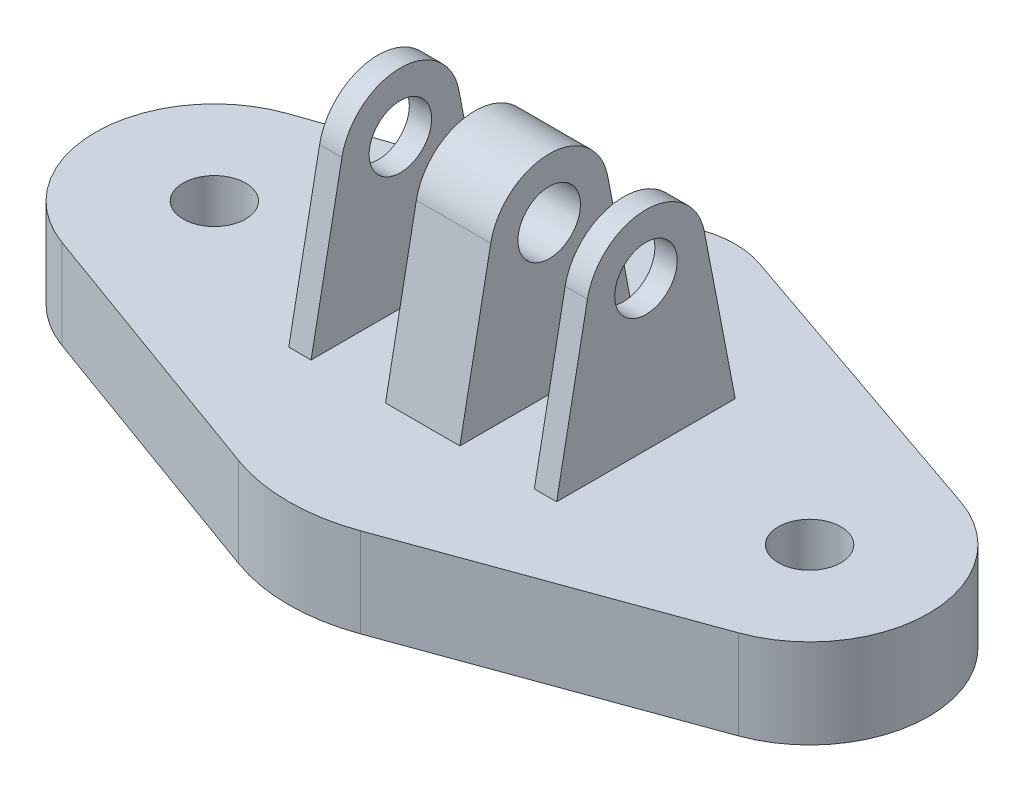
ISO-10303-21;
HEADER;
FILE_DESCRIPTION(('STEP AP214'),'2;1');
FILE_NAME('part.step','',(''),(''),'','','');
FILE_SCHEMA(('AUTOMOTIVE_DESIGN { 1 0 10303 214 1 1 1 1 }'));
ENDSEC;
DATA;
#1=APPLICATION_CONTEXT('core data for automotive mechanical design processes');
#2=APPLICATION_PROTOCOL_DEFINITION('international standard','automotive_design',2000,#1);
#3=PRODUCT_CONTEXT('',#1,'mechanical');
#4=PRODUCT('Part','Part','',(#3));
#5=PRODUCT_RELATED_PRODUCT_CATEGORY('part','',(#4));
#6=PRODUCT_DEFINITION_FORMATION('','',#4);
#7=PRODUCT_DEFINITION_CONTEXT('part definition',#1,'design');
#8=PRODUCT_DEFINITION('design','',#6,#7);
#9=PRODUCT_DEFINITION_SHAPE('','',#8);
#10=(LENGTH_UNIT() NAMED_UNIT(*) SI_UNIT(.MILLI.,.METRE.));
#11=(NAMED_UNIT(*) PLANE_ANGLE_UNIT() SI_UNIT($,.RADIAN.));
#12=(NAMED_UNIT(*) SI_UNIT($,.STERADIAN.) SOLID_ANGLE_UNIT());
#13=UNCERTAINTY_MEASURE_WITH_UNIT(LENGTH_MEASURE(1.E-05),#10,'distance_accuracy_value','');
#14=(GEOMETRIC_REPRESENTATION_CONTEXT(3) GLOBAL_UNCERTAINTY_ASSIGNED_CONTEXT((#13)) GLOBAL_UNIT_ASSIGNED_CONTEXT((#10,
#11,#12)) REPRESENTATION_CONTEXT('',''));
#15=CARTESIAN_POINT('',(0.,0.,0.));
#16=DIRECTION('',(0.,0.,1.));
#17=DIRECTION('',(1.,0.,0.));
#18=AXIS2_PLACEMENT_3D('',#15,#16,#17);
#19=CARTESIAN_POINT('',(9.,16.7566678500182,-3.92777975003039));
#20=DIRECTION('',(0.,-0.189166962504558,0.981944937507597));
#21=DIRECTION('',(0.,-0.981944937507597,-0.189166962504558));
#22=AXIS2_PLACEMENT_3D('',#19,#20,#21);
#23=PLANE('',#22);
#24=DIRECTION('',(0.,0.981944937507597,0.189166962504558));
#25=VECTOR('',#24,1.);
#26=CARTESIAN_POINT('',(2.5,16.7566678500182,-3.92777975003039));
#27=LINE('',#26,#25);
#28=CARTESIAN_POINT('',(2.5,6.,-6.));
#29=VERTEX_POINT('',#28);
#30=CARTESIAN_POINT('',(2.5,16.7566678500182,-3.92777975003039));
#31=VERTEX_POINT('',#30);
#32=EDGE_CURVE('E323',#29,#31,#27,.T.);
#33=ORIENTED_EDGE('',*,*,#32,.F.);
#34=DIRECTION('',(-1.,0.,0.));
#35=VECTOR('',#34,1.);
#36=CARTESIAN_POINT('',(9.,6.,-6.));
#37=LINE('',#36,#35);
#38=CARTESIAN_POINT('',(-2.5,6.,-6.));
#39=VERTEX_POINT('',#38);
#40=EDGE_CURVE('E212',#29,#39,#37,.T.);
#41=ORIENTED_EDGE('',*,*,#40,.T.);
#42=DIRECTION('',(0.,0.981944937507597,0.189166962504558));
#43=VECTOR('',#42,1.);
#44=CARTESIAN_POINT('',(-2.5,16.7566678500182,-3.92777975003039));
#45=LINE('',#44,#43);
#46=CARTESIAN_POINT('',(-2.5,16.7566678500182,-3.92777975003039));
#47=VERTEX_POINT('',#46);
#48=EDGE_CURVE('E295',#39,#47,#45,.T.);
#49=ORIENTED_EDGE('',*,*,#48,.T.);
#50=DIRECTION('',(-1.,0.,0.));
#51=VECTOR('',#50,1.);
#52=CARTESIAN_POINT('',(9.,16.7566678500182,-3.92777975003039));
#53=LINE('',#52,#51);
#54=EDGE_CURVE('E230',#31,#47,#53,.T.);
#55=ORIENTED_EDGE('',*,*,#54,.F.);
#56=EDGE_LOOP('',(#33,#41,#49,#55));
#57=FACE_BOUND('',#56,.T.);
#58=ADVANCED_FACE('F43',(#57),#23,.F.);
#59=DIRECTION('',(0.,-0.981944937507597,-0.189166962504558));
#60=VECTOR('',#59,1.);
#61=CARTESIAN_POINT('',(7.5,16.7566678500182,-3.92777975003039));
#62=LINE('',#61,#60);
#63=CARTESIAN_POINT('',(7.5,16.7566678500182,-3.92777975003039));
#64=VERTEX_POINT('',#63);
#65=CARTESIAN_POINT('',(7.5,6.,-6.));
#66=VERTEX_POINT('',#65);
#67=EDGE_CURVE('E182',#64,#66,#62,.T.);
#68=ORIENTED_EDGE('',*,*,#67,.F.);
#69=CARTESIAN_POINT('',(9.,16.7566678500182,-3.92777975003039));
#70=VERTEX_POINT('',#69);
#71=EDGE_CURVE('E223',#70,#64,#53,.T.);
#72=ORIENTED_EDGE('',*,*,#71,.F.);
#73=DIRECTION('',(0.,0.981944937507597,0.189166962504558));
#74=VECTOR('',#73,1.);
#75=CARTESIAN_POINT('',(9.,16.7566678500182,-3.92777975003039));
#76=LINE('',#75,#74);
#77=CARTESIAN_POINT('',(9.,6.,-6.));
#78=VERTEX_POINT('',#77);
#79=EDGE_CURVE('E208',#78,#70,#76,.T.);
#80=ORIENTED_EDGE('',*,*,#79,.F.);
#81=EDGE_CURVE('E200',#78,#66,#37,.T.);
#82=ORIENTED_EDGE('',*,*,#81,.T.);
#83=EDGE_LOOP('',(#68,#72,#80,#82));
#84=FACE_BOUND('',#83,.T.);
#85=ADVANCED_FACE('F207',(#84),#23,.F.);
#86=CARTESIAN_POINT('',(9.,16.,0.));
#87=DIRECTION('',(-1.,0.,0.));
#88=DIRECTION('',(0.,0.,1.));
#89=AXIS2_PLACEMENT_3D('',#86,#87,#88);
#90=CYLINDRICAL_SURFACE('',#89,4.);
#91=CARTESIAN_POINT('',(2.5,16.,0.));
#92=DIRECTION('',(1.,0.,0.));
#93=DIRECTION('',(0.,0.,-1.));
#94=AXIS2_PLACEMENT_3D('',#91,#92,#93);
#95=CIRCLE('',#94,4.);
#96=CARTESIAN_POINT('',(2.5,16.7566678500182,3.92777975003039));
#97=VERTEX_POINT('',#96);
#98=EDGE_CURVE('E329',#31,#97,#95,.T.);
#99=ORIENTED_EDGE('',*,*,#98,.F.);
#100=ORIENTED_EDGE('',*,*,#54,.T.);
#101=CARTESIAN_POINT('',(-2.5,16.,0.));
#102=DIRECTION('',(1.,0.,0.));
#103=DIRECTION('',(0.,0.,-1.));
#104=AXIS2_PLACEMENT_3D('',#101,#102,#103);
#105=CIRCLE('',#104,4.);
#106=CARTESIAN_POINT('',(-2.5,16.7566678500182,3.92777975003039));
#107=VERTEX_POINT('',#106);
#108=EDGE_CURVE('E302',#47,#107,#105,.T.);
#109=ORIENTED_EDGE('',*,*,#108,.T.);
#110=DIRECTION('',(-1.,0.,0.));
#111=VECTOR('',#110,1.);
#112=CARTESIAN_POINT('',(9.,16.7566678500182,3.92777975003039));
#113=LINE('',#112,#111);
#114=EDGE_CURVE('E243',#97,#107,#113,.T.);
#115=ORIENTED_EDGE('',*,*,#114,.F.);
#116=EDGE_LOOP('',(#99,#100,#109,#115));
#117=FACE_BOUND('',#116,.T.);
#118=ADVANCED_FACE('F377',(#117),#90,.T.);
#119=CARTESIAN_POINT('',(7.5,16.,0.));
#120=DIRECTION('',(-1.,0.,0.));
#121=DIRECTION('',(0.,-1.,0.));
#122=AXIS2_PLACEMENT_3D('',#119,#120,#121);
#123=CIRCLE('',#122,4.);
#124=CARTESIAN_POINT('',(7.5,16.7566678500182,3.92777975003039));
#125=VERTEX_POINT('',#124);
#126=EDGE_CURVE('E188',#125,#64,#123,.T.);
#127=ORIENTED_EDGE('',*,*,#126,.F.);
#128=CARTESIAN_POINT('',(9.,16.7566678500182,3.92777975003039));
#129=VERTEX_POINT('',#128);
#130=EDGE_CURVE('E237',#129,#125,#113,.T.);
#131=ORIENTED_EDGE('',*,*,#130,.F.);
#132=CARTESIAN_POINT('',(9.,16.,0.));
#133=DIRECTION('',(1.,0.,0.));
#134=DIRECTION('',(0.,0.,1.));
#135=AXIS2_PLACEMENT_3D('',#132,#133,#134);
#136=CIRCLE('',#135,4.);
#137=EDGE_CURVE('E266',#70,#129,#136,.T.);
#138=ORIENTED_EDGE('',*,*,#137,.F.);
#139=ORIENTED_EDGE('',*,*,#71,.T.);
#140=EDGE_LOOP('',(#127,#131,#138,#139));
#141=FACE_BOUND('',#140,.T.);
#142=ADVANCED_FACE('F386',(#141),#90,.T.);
#143=CARTESIAN_POINT('',(9.,6.,6.));
#144=DIRECTION('',(0.,-0.189166962504558,-0.981944937507597));
#145=DIRECTION('',(0.,0.981944937507597,-0.189166962504558));
#146=AXIS2_PLACEMENT_3D('',#143,#144,#145);
#147=PLANE('',#146);
#148=DIRECTION('',(0.,-0.981944937507597,0.189166962504558));
#149=VECTOR('',#148,1.);
#150=CARTESIAN_POINT('',(2.5,6.,6.));
#151=LINE('',#150,#149);
#152=CARTESIAN_POINT('',(2.5,6.,6.));
#153=VERTEX_POINT('',#152);
#154=EDGE_CURVE('E332',#97,#153,#151,.T.);
#155=ORIENTED_EDGE('',*,*,#154,.F.);
#156=ORIENTED_EDGE('',*,*,#114,.T.);
#157=DIRECTION('',(0.,-0.981944937507597,0.189166962504558));
#158=VECTOR('',#157,1.);
#159=CARTESIAN_POINT('',(-2.5,6.,6.));
#160=LINE('',#159,#158);
#161=CARTESIAN_POINT('',(-2.5,6.,6.));
#162=VERTEX_POINT('',#161);
#163=EDGE_CURVE('E306',#107,#162,#160,.T.);
#164=ORIENTED_EDGE('',*,*,#163,.T.);
#165=DIRECTION('',(-1.,0.,0.));
#166=VECTOR('',#165,1.);
#167=CARTESIAN_POINT('',(9.,6.,6.));
#168=LINE('',#167,#166);
#169=EDGE_CURVE('E255',#153,#162,#168,.T.);
#170=ORIENTED_EDGE('',*,*,#169,.F.);
#171=EDGE_LOOP('',(#155,#156,#164,#170));
#172=FACE_BOUND('',#171,.T.);
#173=ADVANCED_FACE('F384',(#172),#147,.F.);
#174=DIRECTION('',(0.,0.981944937507597,-0.189166962504558));
#175=VECTOR('',#174,1.);
#176=CARTESIAN_POINT('',(7.5,6.,6.));
#177=LINE('',#176,#175);
#178=CARTESIAN_POINT('',(7.5,6.,6.));
#179=VERTEX_POINT('',#178);
#180=EDGE_CURVE('E340',#179,#125,#177,.T.);
#181=ORIENTED_EDGE('',*,*,#180,.F.);
#182=CARTESIAN_POINT('',(9.,6.,6.));
#183=VERTEX_POINT('',#182);
#184=EDGE_CURVE('E203',#183,#179,#168,.T.);
#185=ORIENTED_EDGE('',*,*,#184,.F.);
#186=DIRECTION('',(0.,-0.981944937507597,0.189166962504558));
#187=VECTOR('',#186,1.);
#188=CARTESIAN_POINT('',(9.,6.,6.));
#189=LINE('',#188,#187);
#190=EDGE_CURVE('E260',#129,#183,#189,.T.);
#191=ORIENTED_EDGE('',*,*,#190,.F.);
#192=ORIENTED_EDGE('',*,*,#130,.T.);
#193=EDGE_LOOP('',(#181,#185,#191,#192));
#194=FACE_BOUND('',#193,.T.);
#195=ADVANCED_FACE('F360',(#194),#147,.F.);
#196=CARTESIAN_POINT('',(9.,16.,0.));
#197=DIRECTION('',(-1.,0.,0.));
#198=DIRECTION('',(0.,0.,1.));
#199=AXIS2_PLACEMENT_3D('',#196,#197,#198);
#200=CYLINDRICAL_SURFACE('',#199,2.1);
#201=CARTESIAN_POINT('',(-2.5,16.,0.));
#202=DIRECTION('',(1.,0.,0.));
#203=DIRECTION('',(0.,0.,-1.));
#204=AXIS2_PLACEMENT_3D('',#201,#202,#203);
#205=CIRCLE('',#204,2.1);
#206=CARTESIAN_POINT('',(-2.5,16.,2.1));
#207=VERTEX_POINT('',#206);
#208=EDGE_CURVE('E47',#207,#207,#205,.T.);
#209=CARTESIAN_POINT('',(2.5,16.,0.));
#210=DIRECTION('',(1.,0.,0.));
#211=DIRECTION('',(0.,0.,-1.));
#212=AXIS2_PLACEMENT_3D('',#209,#210,#211);
#213=CIRCLE('',#212,2.1);
#214=CARTESIAN_POINT('',(2.5,16.,2.1));
#215=VERTEX_POINT('',#214);
#216=EDGE_CURVE('E194',#215,#215,#213,.T.);
#217=CARTESIAN_POINT('',(-2.5,16.,2.1));
#218=CARTESIAN_POINT('',(-2.44791666666667,16.,2.1));
#219=CARTESIAN_POINT('',(-2.39583333333333,16.,2.1));
#220=CARTESIAN_POINT('',(-2.29166666666667,16.,2.1));
#221=CARTESIAN_POINT('',(-2.23958333333333,16.,2.1));
#222=CARTESIAN_POINT('',(-2.13541666666667,16.,2.1));
#223=CARTESIAN_POINT('',(-2.08333333333333,16.,2.1));
#224=CARTESIAN_POINT('',(-1.97916666666667,16.,2.1));
#225=CARTESIAN_POINT('',(-1.92708333333333,16.,2.1));
#226=CARTESIAN_POINT('',(-1.82291666666667,16.,2.1));
#227=CARTESIAN_POINT('',(-1.77083333333333,16.,2.1));
#228=CARTESIAN_POINT('',(-1.66666666666667,16.,2.1));
#229=CARTESIAN_POINT('',(-1.61458333333333,16.,2.1));
#230=CARTESIAN_POINT('',(-1.51041666666667,16.,2.1));
#231=CARTESIAN_POINT('',(-1.45833333333333,16.,2.1));
#232=CARTESIAN_POINT('',(-1.35416666666667,16.,2.1));
#233=CARTESIAN_POINT('',(-1.30208333333333,16.,2.1));
#234=CARTESIAN_POINT('',(-1.19791666666667,16.,2.1));
#235=CARTESIAN_POINT('',(-1.14583333333333,16.,2.1));
#236=CARTESIAN_POINT('',(-1.04166666666667,16.,2.1));
#237=CARTESIAN_POINT('',(-0.989583333333334,16.,2.1));
#238=CARTESIAN_POINT('',(-0.885416666666668,16.,2.1));
#239=CARTESIAN_POINT('',(-0.833333333333334,16.,2.1));
#240=CARTESIAN_POINT('',(-0.729166666666667,16.,2.1));
#241=CARTESIAN_POINT('',(-0.677083333333334,16.,2.1));
#242=CARTESIAN_POINT('',(-0.572916666666667,16.,2.1));
#243=CARTESIAN_POINT('',(-0.520833333333334,16.,2.1));
#244=CARTESIAN_POINT('',(-0.416666666666667,16.,2.1));
#245=CARTESIAN_POINT('',(-0.364583333333334,16.,2.1));
#246=CARTESIAN_POINT('',(-0.260416666666667,16.,2.1));
#247=CARTESIAN_POINT('',(-0.208333333333334,16.,2.1));
#248=CARTESIAN_POINT('',(-0.104166666666667,16.,2.1));
#249=CARTESIAN_POINT('',(-0.0520833333333334,16.,2.1));
#250=CARTESIAN_POINT('',(0.0520833333333334,16.,2.1));
#251=CARTESIAN_POINT('',(0.104166666666667,16.,2.1));
#252=CARTESIAN_POINT('',(0.208333333333334,16.,2.1));
#253=CARTESIAN_POINT('',(0.260416666666667,16.,2.1));
#254=CARTESIAN_POINT('',(0.364583333333334,16.,2.1));
#255=CARTESIAN_POINT('',(0.416666666666667,16.,2.1));
#256=CARTESIAN_POINT('',(0.520833333333334,16.,2.1));
#257=CARTESIAN_POINT('',(0.572916666666667,16.,2.1));
#258=CARTESIAN_POINT('',(0.677083333333334,16.,2.1));
#259=CARTESIAN_POINT('',(0.729166666666667,16.,2.1));
#260=CARTESIAN_POINT('',(0.833333333333333,16.,2.1));
#261=CARTESIAN_POINT('',(0.885416666666666,16.,2.1));
#262=CARTESIAN_POINT('',(0.989583333333333,16.,2.1));
#263=CARTESIAN_POINT('',(1.04166666666667,16.,2.1));
#264=CARTESIAN_POINT('',(1.14583333333333,16.,2.1));
#265=CARTESIAN_POINT('',(1.19791666666667,16.,2.1));
#266=CARTESIAN_POINT('',(1.30208333333333,16.,2.1));
#267=CARTESIAN_POINT('',(1.35416666666667,16.,2.1));
#268=CARTESIAN_POINT('',(1.45833333333333,16.,2.1));
#269=CARTESIAN_POINT('',(1.51041666666667,16.,2.1));
#270=CARTESIAN_POINT('',(1.61458333333333,16.,2.1));
#271=CARTESIAN_POINT('',(1.66666666666667,16.,2.1));
#272=CARTESIAN_POINT('',(1.77083333333333,16.,2.1));
#273=CARTESIAN_POINT('',(1.82291666666667,16.,2.1));
#274=CARTESIAN_POINT('',(1.92708333333333,16.,2.1));
#275=CARTESIAN_POINT('',(1.97916666666667,16.,2.1));
#276=CARTESIAN_POINT('',(2.08333333333333,16.,2.1));
#277=CARTESIAN_POINT('',(2.13541666666667,16.,2.1));
#278=CARTESIAN_POINT('',(2.23958333333333,16.,2.1));
#279=CARTESIAN_POINT('',(2.29166666666667,16.,2.1));
#280=CARTESIAN_POINT('',(2.39583333333333,16.,2.1));
#281=CARTESIAN_POINT('',(2.44791666666667,16.,2.1));
#282=CARTESIAN_POINT('',(2.5,16.,2.1));
#283=B_SPLINE_CURVE_WITH_KNOTS('',3,(#217,#218,#219,#220,#221,#222,#223,#224,#225,#226,#227,
#228,#229,#230,#231,#232,#233,#234,#235,#236,#237,#238,#239,#240,#241,#242,#243,#244,#245,#246,
#247,#248,#249,#250,#251,#252,#253,#254,#255,#256,#257,#258,#259,#260,#261,#262,#263,#264,#265,
#266,#267,#268,#269,#270,#271,#272,#273,#274,#275,#276,#277,#278,#279,#280,#281,#282),
.UNSPECIFIED.,.F.,.F.,(4,2,2,2,2,2,2,2,2,2,2,2,2,2,2,2,2,2,2,2,2,2,2,2,2,2,2,2,2,2,2,2,4),(0.,
0.15625,0.3125,0.46875,0.625000000000001,0.781250000000001,0.937500000000001,1.09375,1.25,
1.40625,1.5625,1.71875,1.875,2.03125,2.1875,2.34375,2.5,2.65625,2.8125,2.96875,3.125,3.28125,
3.4375,3.59375,3.75,3.90625,4.0625,4.21875,4.375,4.53125,4.6875,4.84375,5.),.UNSPECIFIED.);
#284=EDGE_CURVE('BSEAM356',#207,#215,#283,.T.);
#285=ORIENTED_EDGE('',*,*,#208,.F.);
#286=ORIENTED_EDGE('',*,*,#216,.T.);
#287=ORIENTED_EDGE('',*,*,#284,.T.);
#288=ORIENTED_EDGE('',*,*,#284,.F.);
#289=EDGE_LOOP('',(#285,#287,#286,#288));
#290=FACE_BOUND('',#289,.T.);
#291=ADVANCED_FACE('F356',(#290),#200,.F.);
#292=CARTESIAN_POINT('',(9.,16.,0.));
#293=DIRECTION('',(1.,0.,0.));
#294=DIRECTION('',(0.,0.,-1.));
#295=AXIS2_PLACEMENT_3D('',#292,#293,#294);
#296=CIRCLE('',#295,2.1);
#297=CARTESIAN_POINT('',(9.,16.,-2.1));
#298=VERTEX_POINT('',#297);
#299=EDGE_CURVE('E277',#298,#298,#296,.T.);
#300=ORIENTED_EDGE('',*,*,#299,.T.);
#301=EDGE_LOOP('',(#300));
#302=FACE_BOUND('',#301,.T.);
#303=CARTESIAN_POINT('',(7.5,16.,0.));
#304=DIRECTION('',(-1.,0.,0.));
#305=DIRECTION('',(0.,-1.,0.));
#306=AXIS2_PLACEMENT_3D('',#303,#304,#305);
#307=CIRCLE('',#306,2.1);
#308=CARTESIAN_POINT('',(7.5,13.9,0.));
#309=VERTEX_POINT('',#308);
#310=EDGE_CURVE('E205',#309,#309,#307,.T.);
#311=ORIENTED_EDGE('',*,*,#310,.T.);
#312=EDGE_LOOP('',(#311));
#313=FACE_BOUND('',#312,.T.);
#314=ADVANCED_FACE('F359',(#302,#313),#200,.F.);
#315=CARTESIAN_POINT('',(20.,6.,0.));
#316=DIRECTION('',(0.,-1.,0.));
#317=DIRECTION('',(0.,0.,-1.));
#318=AXIS2_PLACEMENT_3D('',#315,#316,#317);
#319=PLANE('',#318);
#320=ORIENTED_EDGE('',*,*,#40,.F.);
#321=DIRECTION('',(0.,0.,1.));
#322=VECTOR('',#321,1.);
#323=CARTESIAN_POINT('',(2.5,6.,-15.));
#324=LINE('',#323,#322);
#325=EDGE_CURVE('E61',#29,#153,#324,.T.);
#326=ORIENTED_EDGE('',*,*,#325,.T.);
#327=ORIENTED_EDGE('',*,*,#169,.T.);
#328=DIRECTION('',(0.,0.,1.));
#329=VECTOR('',#328,1.);
#330=CARTESIAN_POINT('',(-2.5,6.,-15.));
#331=LINE('',#330,#329);
#332=EDGE_CURVE('E322',#39,#162,#331,.T.);
#333=ORIENTED_EDGE('',*,*,#332,.F.);
#334=EDGE_LOOP('',(#320,#326,#327,#333));
#335=FACE_BOUND('',#334,.T.);
#336=DIRECTION('',(0.,0.,1.));
#337=VECTOR('',#336,1.);
#338=CARTESIAN_POINT('',(7.5,6.,-15.));
#339=LINE('',#338,#337);
#340=EDGE_CURVE('E185',#66,#179,#339,.T.);
#341=ORIENTED_EDGE('',*,*,#340,.F.);
#342=ORIENTED_EDGE('',*,*,#81,.F.);
#343=DIRECTION('',(0.,0.,-1.));
#344=VECTOR('',#343,1.);
#345=CARTESIAN_POINT('',(9.,6.,-6.));
#346=LINE('',#345,#344);
#347=EDGE_CURVE('E284',#183,#78,#346,.T.);
#348=ORIENTED_EDGE('',*,*,#347,.F.);
#349=ORIENTED_EDGE('',*,*,#184,.T.);
#350=EDGE_LOOP('',(#341,#342,#348,#349));
#351=FACE_BOUND('',#350,.T.);
#352=DIRECTION('',(-0.945543853132705,0.,-0.325494733909717));
#353=VECTOR('',#352,1.);
#354=CARTESIAN_POINT('',(22.6039578712777,6.,-7.56435082506164));
#355=LINE('',#354,#353);
#356=CARTESIAN_POINT('',(22.6039578712777,6.,-7.56435082506164));
#357=VERTEX_POINT('',#356);
#358=CARTESIAN_POINT('',(1.9529684034583,6.,-14.6732631187962));
#359=VERTEX_POINT('',#358);
#360=EDGE_CURVE('E817',#357,#359,#355,.T.);
#361=ORIENTED_EDGE('',*,*,#360,.T.);
#362=CARTESIAN_POINT('',(0.,6.,-9.));
#363=DIRECTION('',(0.,1.,0.));
#364=DIRECTION('',(0.,0.,1.));
#365=AXIS2_PLACEMENT_3D('',#362,#363,#364);
#366=CIRCLE('',#365,6.);
#367=CARTESIAN_POINT('',(-1.95296840345831,6.,-14.6732631187962));
#368=VERTEX_POINT('',#367);
#369=EDGE_CURVE('E776',#359,#368,#366,.T.);
#370=ORIENTED_EDGE('',*,*,#369,.T.);
#371=DIRECTION('',(0.945543853132705,0.,-0.325494733909717));
#372=VECTOR('',#371,1.);
#373=CARTESIAN_POINT('',(-22.6039578712777,6.,-7.56435082506164));
#374=LINE('',#373,#372);
#375=CARTESIAN_POINT('',(-22.6039578712777,6.,-7.56435082506164));
#376=VERTEX_POINT('',#375);
#377=EDGE_CURVE('E801',#376,#368,#374,.T.);
#378=ORIENTED_EDGE('',*,*,#377,.F.);
#379=CARTESIAN_POINT('',(-20.,6.,0.));
#380=DIRECTION('',(0.,-1.,0.));
#381=DIRECTION('',(0.,0.,-1.));
#382=AXIS2_PLACEMENT_3D('',#379,#380,#381);
#383=CIRCLE('',#382,8.);
#384=CARTESIAN_POINT('',(-22.7280720353017,6.,7.52048023534436));
#385=VERTEX_POINT('',#384);
#386=EDGE_CURVE('E786',#385,#376,#383,.T.);
#387=ORIENTED_EDGE('',*,*,#386,.F.);
#388=DIRECTION('',(-0.940060029418045,0.,-0.341009004412706));
#389=VECTOR('',#388,1.);
#390=CARTESIAN_POINT('',(-22.7280720353017,6.,7.52048023534436));
#391=LINE('',#390,#389);
#392=CARTESIAN_POINT('',(-4.09210805295248,6.,14.2807203530165));
#393=VERTEX_POINT('',#392);
#394=EDGE_CURVE('E792',#393,#385,#391,.T.);
#395=ORIENTED_EDGE('',*,*,#394,.F.);
#396=CARTESIAN_POINT('',(0.,6.,3.));
#397=DIRECTION('',(0.,1.,0.));
#398=DIRECTION('',(0.,0.,-1.));
#399=AXIS2_PLACEMENT_3D('',#396,#397,#398);
#400=CIRCLE('',#399,12.);
#401=CARTESIAN_POINT('',(4.09210805295248,6.,14.2807203530165));
#402=VERTEX_POINT('',#401);
#403=EDGE_CURVE('E821',#393,#402,#400,.T.);
#404=ORIENTED_EDGE('',*,*,#403,.T.);
#405=DIRECTION('',(0.940060029418045,0.,-0.341009004412707));
#406=VECTOR('',#405,1.);
#407=CARTESIAN_POINT('',(22.7280720353017,6.,7.52048023534436));
#408=LINE('',#407,#406);
#409=CARTESIAN_POINT('',(22.7280720353017,6.,7.52048023534436));
#410=VERTEX_POINT('',#409);
#411=EDGE_CURVE('E750',#402,#410,#408,.T.);
#412=ORIENTED_EDGE('',*,*,#411,.T.);
#413=CARTESIAN_POINT('',(20.,6.,0.));
#414=DIRECTION('',(0.,1.,0.));
#415=DIRECTION('',(0.,0.,-1.));
#416=AXIS2_PLACEMENT_3D('',#413,#414,#415);
#417=CIRCLE('',#416,8.);
#418=EDGE_CURVE('E761',#410,#357,#417,.T.);
#419=ORIENTED_EDGE('',*,*,#418,.T.);
#420=EDGE_LOOP('',(#361,#370,#378,#387,#395,#404,#412,#419));
#421=FACE_BOUND('',#420,.T.);
#422=CARTESIAN_POINT('',(20.,6.,0.));
#423=DIRECTION('',(0.,1.,0.));
#424=DIRECTION('',(0.,0.,1.));
#425=AXIS2_PLACEMENT_3D('',#422,#423,#424);
#426=CIRCLE('',#425,2.1);
#427=CARTESIAN_POINT('',(20.,6.,2.1));
#428=VERTEX_POINT('',#427);
#429=EDGE_CURVE('E740',#428,#428,#426,.T.);
#430=ORIENTED_EDGE('',*,*,#429,.F.);
#431=EDGE_LOOP('',(#430));
#432=FACE_BOUND('',#431,.T.);
#433=DIRECTION('',(0.,0.,1.));
#434=VECTOR('',#433,1.);
#435=CARTESIAN_POINT('',(-7.5,6.,-15.));
#436=LINE('',#435,#434);
#437=CARTESIAN_POINT('',(-7.5,6.,-6.));
#438=VERTEX_POINT('',#437);
#439=CARTESIAN_POINT('',(-7.5,6.,6.));
#440=VERTEX_POINT('',#439);
#441=EDGE_CURVE('E319',#438,#440,#436,.T.);
#442=ORIENTED_EDGE('',*,*,#441,.T.);
#443=CARTESIAN_POINT('',(-9.,6.,6.));
#444=VERTEX_POINT('',#443);
#445=EDGE_CURVE('E256',#440,#444,#168,.T.);
#446=ORIENTED_EDGE('',*,*,#445,.T.);
#447=DIRECTION('',(0.,0.,-1.));
#448=VECTOR('',#447,1.);
#449=CARTESIAN_POINT('',(-9.,6.,-6.));
#450=LINE('',#449,#448);
#451=CARTESIAN_POINT('',(-9.,6.,-6.));
#452=VERTEX_POINT('',#451);
#453=EDGE_CURVE('E273',#444,#452,#450,.T.);
#454=ORIENTED_EDGE('',*,*,#453,.T.);
#455=EDGE_CURVE('E214',#438,#452,#37,.T.);
#456=ORIENTED_EDGE('',*,*,#455,.F.);
#457=EDGE_LOOP('',(#442,#446,#454,#456));
#458=FACE_BOUND('',#457,.T.);
#459=CARTESIAN_POINT('',(-20.,6.,0.));
#460=DIRECTION('',(0.,-1.,0.));
#461=DIRECTION('',(0.,0.,1.));
#462=AXIS2_PLACEMENT_3D('',#459,#460,#461);
#463=CIRCLE('',#462,2.1);
#464=CARTESIAN_POINT('',(-20.,6.,2.1));
#465=VERTEX_POINT('',#464);
#466=EDGE_CURVE('E218',#465,#465,#463,.T.);
#467=ORIENTED_EDGE('',*,*,#466,.T.);
#468=EDGE_LOOP('',(#467));
#469=FACE_BOUND('',#468,.T.);
#470=ADVANCED_FACE('F198',(#335,#351,#421,#432,#458,#469),#319,.F.);
#471=CARTESIAN_POINT('',(20.,0.,0.));
#472=DIRECTION('',(0.,-1.,0.));
#473=DIRECTION('',(0.,0.,-1.));
#474=AXIS2_PLACEMENT_3D('',#471,#472,#473);
#475=PLANE('',#474);
#476=CARTESIAN_POINT('',(20.,0.,0.));
#477=DIRECTION('',(0.,1.,0.));
#478=DIRECTION('',(0.,0.,-1.));
#479=AXIS2_PLACEMENT_3D('',#476,#477,#478);
#480=CIRCLE('',#479,8.);
#481=CARTESIAN_POINT('',(22.7280720353017,0.,7.52048023534436));
#482=VERTEX_POINT('',#481);
#483=CARTESIAN_POINT('',(22.6039578712777,0.,-7.56435082506164));
#484=VERTEX_POINT('',#483);
#485=EDGE_CURVE('E733',#482,#484,#480,.T.);
#486=ORIENTED_EDGE('',*,*,#485,.F.);
#487=DIRECTION('',(0.940060029418045,0.,-0.341009004412707));
#488=VECTOR('',#487,1.);
#489=CARTESIAN_POINT('',(22.7280720353017,0.,7.52048023534436));
#490=LINE('',#489,#488);
#491=CARTESIAN_POINT('',(4.09210805295248,0.,14.2807203530165));
#492=VERTEX_POINT('',#491);
#493=EDGE_CURVE('E758',#492,#482,#490,.T.);
#494=ORIENTED_EDGE('',*,*,#493,.F.);
#495=CARTESIAN_POINT('',(0.,0.,3.));
#496=DIRECTION('',(0.,1.,0.));
#497=DIRECTION('',(0.,0.,-1.));
#498=AXIS2_PLACEMENT_3D('',#495,#496,#497);
#499=CIRCLE('',#498,12.);
#500=CARTESIAN_POINT('',(-4.09210805295248,0.,14.2807203530165));
#501=VERTEX_POINT('',#500);
#502=EDGE_CURVE('E755',#501,#492,#499,.T.);
#503=ORIENTED_EDGE('',*,*,#502,.F.);
#504=DIRECTION('',(-0.940060029418045,0.,-0.341009004412706));
#505=VECTOR('',#504,1.);
#506=CARTESIAN_POINT('',(-22.7280720353017,0.,7.52048023534436));
#507=LINE('',#506,#505);
#508=CARTESIAN_POINT('',(-22.7280720353017,0.,7.52048023534436));
#509=VERTEX_POINT('',#508);
#510=EDGE_CURVE('E787',#501,#509,#507,.T.);
#511=ORIENTED_EDGE('',*,*,#510,.T.);
#512=CARTESIAN_POINT('',(-20.,0.,0.));
#513=DIRECTION('',(0.,-1.,0.));
#514=DIRECTION('',(0.,0.,-1.));
#515=AXIS2_PLACEMENT_3D('',#512,#513,#514);
#516=CIRCLE('',#515,8.);
#517=CARTESIAN_POINT('',(-22.6039578712777,0.,-7.56435082506164));
#518=VERTEX_POINT('',#517);
#519=EDGE_CURVE('E784',#509,#518,#516,.T.);
#520=ORIENTED_EDGE('',*,*,#519,.T.);
#521=DIRECTION('',(0.945543853132705,0.,-0.325494733909717));
#522=VECTOR('',#521,1.);
#523=CARTESIAN_POINT('',(-22.6039578712777,0.,-7.56435082506164));
#524=LINE('',#523,#522);
#525=CARTESIAN_POINT('',(-1.95296840345831,0.,-14.6732631187962));
#526=VERTEX_POINT('',#525);
#527=EDGE_CURVE('E781',#518,#526,#524,.T.);
#528=ORIENTED_EDGE('',*,*,#527,.T.);
#529=CARTESIAN_POINT('',(0.,0.,-9.));
#530=DIRECTION('',(0.,1.,0.));
#531=DIRECTION('',(0.,0.,1.));
#532=AXIS2_PLACEMENT_3D('',#529,#530,#531);
#533=CIRCLE('',#532,6.);
#534=CARTESIAN_POINT('',(1.9529684034583,0.,-14.6732631187962));
#535=VERTEX_POINT('',#534);
#536=EDGE_CURVE('E744',#535,#526,#533,.T.);
#537=ORIENTED_EDGE('',*,*,#536,.F.);
#538=DIRECTION('',(-0.945543853132705,0.,-0.325494733909717));
#539=VECTOR('',#538,1.);
#540=CARTESIAN_POINT('',(22.6039578712777,0.,-7.56435082506164));
#541=LINE('',#540,#539);
#542=EDGE_CURVE('E739',#484,#535,#541,.T.);
#543=ORIENTED_EDGE('',*,*,#542,.F.);
#544=EDGE_LOOP('',(#486,#494,#503,#511,#520,#528,#537,#543));
#545=FACE_BOUND('',#544,.T.);
#546=CARTESIAN_POINT('',(20.,0.,0.));
#547=DIRECTION('',(0.,1.,0.));
#548=DIRECTION('',(0.,0.,1.));
#549=AXIS2_PLACEMENT_3D('',#546,#547,#548);
#550=CIRCLE('',#549,2.1);
#551=CARTESIAN_POINT('',(20.,0.,2.1));
#552=VERTEX_POINT('',#551);
#553=EDGE_CURVE('E747',#552,#552,#550,.T.);
#554=ORIENTED_EDGE('',*,*,#553,.T.);
#555=EDGE_LOOP('',(#554));
#556=FACE_BOUND('',#555,.T.);
#557=CARTESIAN_POINT('',(-20.,0.,0.));
#558=DIRECTION('',(0.,-1.,0.));
#559=DIRECTION('',(0.,0.,1.));
#560=AXIS2_PLACEMENT_3D('',#557,#558,#559);
#561=CIRCLE('',#560,2.1);
#562=CARTESIAN_POINT('',(-20.,0.,2.1));
#563=VERTEX_POINT('',#562);
#564=EDGE_CURVE('E211',#563,#563,#561,.T.);
#565=ORIENTED_EDGE('',*,*,#564,.F.);
#566=EDGE_LOOP('',(#565));
#567=FACE_BOUND('',#566,.T.);
#568=ADVANCED_FACE('F500',(#545,#556,#567),#475,.T.);
#569=CARTESIAN_POINT('',(20.,6.,0.));
#570=DIRECTION('',(0.,-1.,0.));
#571=DIRECTION('',(0.,0.,-1.));
#572=AXIS2_PLACEMENT_3D('',#569,#570,#571);
#573=CYLINDRICAL_SURFACE('',#572,8.);
#574=ORIENTED_EDGE('',*,*,#485,.T.);
#575=DIRECTION('',(0.,-1.,0.));
#576=VECTOR('',#575,1.);
#577=CARTESIAN_POINT('',(22.6039578712777,6.,-7.56435082506164));
#578=LINE('',#577,#576);
#579=EDGE_CURVE('E11',#357,#484,#578,.T.);
#580=ORIENTED_EDGE('',*,*,#579,.F.);
#581=ORIENTED_EDGE('',*,*,#418,.F.);
#582=DIRECTION('',(0.,-1.,0.));
#583=VECTOR('',#582,1.);
#584=CARTESIAN_POINT('',(22.7280720353017,6.,7.52048023534436));
#585=LINE('',#584,#583);
#586=EDGE_CURVE('E736',#410,#482,#585,.T.);
#587=ORIENTED_EDGE('',*,*,#586,.T.);
#588=EDGE_LOOP('',(#574,#580,#581,#587));
#589=FACE_BOUND('',#588,.T.);
#590=ADVANCED_FACE('F45',(#589),#573,.T.);
#591=CARTESIAN_POINT('',(22.6039578712777,6.,-7.56435082506164));
#592=DIRECTION('',(-0.325494733909717,0.,0.945543853132705));
#593=DIRECTION('',(0.945543853132705,0.,0.325494733909717));
#594=AXIS2_PLACEMENT_3D('',#591,#592,#593);
#595=PLANE('',#594);
#596=ORIENTED_EDGE('',*,*,#542,.T.);
#597=DIRECTION('',(0.,-1.,0.));
#598=VECTOR('',#597,1.);
#599=CARTESIAN_POINT('',(1.9529684034583,6.,-14.6732631187962));
#600=LINE('',#599,#598);
#601=EDGE_CURVE('E53',#359,#535,#600,.T.);
#602=ORIENTED_EDGE('',*,*,#601,.F.);
#603=ORIENTED_EDGE('',*,*,#360,.F.);
#604=ORIENTED_EDGE('',*,*,#579,.T.);
#605=EDGE_LOOP('',(#596,#602,#603,#604));
#606=FACE_BOUND('',#605,.T.);
#607=ADVANCED_FACE('F484',(#606),#595,.F.);
#608=CARTESIAN_POINT('',(0.,6.,-9.));
#609=DIRECTION('',(0.,-1.,0.));
#610=DIRECTION('',(0.,0.,-1.));
#611=AXIS2_PLACEMENT_3D('',#608,#609,#610);
#612=CYLINDRICAL_SURFACE('',#611,6.);
#613=ORIENTED_EDGE('',*,*,#536,.T.);
#614=DIRECTION('',(0.,-1.,0.));
#615=VECTOR('',#614,1.);
#616=CARTESIAN_POINT('',(-1.95296840345831,6.,-14.6732631187962));
#617=LINE('',#616,#615);
#618=EDGE_CURVE('E800',#368,#526,#617,.T.);
#619=ORIENTED_EDGE('',*,*,#618,.F.);
#620=ORIENTED_EDGE('',*,*,#369,.F.);
#621=ORIENTED_EDGE('',*,*,#601,.T.);
#622=EDGE_LOOP('',(#613,#619,#620,#621));
#623=FACE_BOUND('',#622,.T.);
#624=ADVANCED_FACE('F475',(#623),#612,.T.);
#625=CARTESIAN_POINT('',(0.,6.,3.));
#626=DIRECTION('',(0.,-1.,0.));
#627=DIRECTION('',(0.,0.,-1.));
#628=AXIS2_PLACEMENT_3D('',#625,#626,#627);
#629=CYLINDRICAL_SURFACE('',#628,12.);
#630=ORIENTED_EDGE('',*,*,#502,.T.);
#631=DIRECTION('',(0.,-1.,0.));
#632=VECTOR('',#631,1.);
#633=CARTESIAN_POINT('',(4.09210805295248,6.,14.2807203530165));
#634=LINE('',#633,#632);
#635=EDGE_CURVE('E764',#402,#492,#634,.T.);
#636=ORIENTED_EDGE('',*,*,#635,.F.);
#637=ORIENTED_EDGE('',*,*,#403,.F.);
#638=DIRECTION('',(0.,-1.,0.));
#639=VECTOR('',#638,1.);
#640=CARTESIAN_POINT('',(-4.09210805295248,6.,14.2807203530165));
#641=LINE('',#640,#639);
#642=EDGE_CURVE('E804',#393,#501,#641,.T.);
#643=ORIENTED_EDGE('',*,*,#642,.T.);
#644=EDGE_LOOP('',(#630,#636,#637,#643));
#645=FACE_BOUND('',#644,.T.);
#646=ADVANCED_FACE('F461',(#645),#629,.T.);
#647=CARTESIAN_POINT('',(22.7280720353017,6.,7.52048023534436));
#648=DIRECTION('',(-0.341009004412706,0.,-0.940060029418044));
#649=DIRECTION('',(-0.940060029418045,0.,0.341009004412707));
#650=AXIS2_PLACEMENT_3D('',#647,#648,#649);
#651=PLANE('',#650);
#652=ORIENTED_EDGE('',*,*,#493,.T.);
#653=ORIENTED_EDGE('',*,*,#586,.F.);
#654=ORIENTED_EDGE('',*,*,#411,.F.);
#655=ORIENTED_EDGE('',*,*,#635,.T.);
#656=EDGE_LOOP('',(#652,#653,#654,#655));
#657=FACE_BOUND('',#656,.T.);
#658=ADVANCED_FACE('F455',(#657),#651,.F.);
#659=CARTESIAN_POINT('',(20.,6.,0.));
#660=DIRECTION('',(0.,-1.,0.));
#661=DIRECTION('',(0.,0.,-1.));
#662=AXIS2_PLACEMENT_3D('',#659,#660,#661);
#663=CYLINDRICAL_SURFACE('',#662,2.1);
#664=ORIENTED_EDGE('',*,*,#429,.T.);
#665=EDGE_LOOP('',(#664));
#666=FACE_BOUND('',#665,.T.);
#667=ORIENTED_EDGE('',*,*,#553,.F.);
#668=EDGE_LOOP('',(#667));
#669=FACE_BOUND('',#668,.T.);
#670=ADVANCED_FACE('F460',(#666,#669),#663,.F.);
#671=CARTESIAN_POINT('',(-20.,6.,0.));
#672=DIRECTION('',(0.,-1.,0.));
#673=DIRECTION('',(0.,0.,-1.));
#674=AXIS2_PLACEMENT_3D('',#671,#672,#673);
#675=CYLINDRICAL_SURFACE('',#674,8.);
#676=ORIENTED_EDGE('',*,*,#519,.F.);
#677=DIRECTION('',(0.,-1.,0.));
#678=VECTOR('',#677,1.);
#679=CARTESIAN_POINT('',(-22.7280720353017,6.,7.52048023534436));
#680=LINE('',#679,#678);
#681=EDGE_CURVE('E808',#385,#509,#680,.T.);
#682=ORIENTED_EDGE('',*,*,#681,.F.);
#683=ORIENTED_EDGE('',*,*,#386,.T.);
#684=DIRECTION('',(0.,-1.,0.));
#685=VECTOR('',#684,1.);
#686=CARTESIAN_POINT('',(-22.6039578712777,6.,-7.56435082506164));
#687=LINE('',#686,#685);
#688=EDGE_CURVE('E797',#376,#518,#687,.T.);
#689=ORIENTED_EDGE('',*,*,#688,.T.);
#690=EDGE_LOOP('',(#676,#682,#683,#689));
#691=FACE_BOUND('',#690,.T.);
#692=ADVANCED_FACE('F615',(#691),#675,.T.);
#693=CARTESIAN_POINT('',(-22.7280720353017,6.,7.52048023534436));
#694=DIRECTION('',(-0.341009004412706,0.,0.940060029418044));
#695=DIRECTION('',(0.940060029418045,0.,0.341009004412706));
#696=AXIS2_PLACEMENT_3D('',#693,#694,#695);
#697=PLANE('',#696);
#698=ORIENTED_EDGE('',*,*,#510,.F.);
#699=ORIENTED_EDGE('',*,*,#642,.F.);
#700=ORIENTED_EDGE('',*,*,#394,.T.);
#701=ORIENTED_EDGE('',*,*,#681,.T.);
#702=EDGE_LOOP('',(#698,#699,#700,#701));
#703=FACE_BOUND('',#702,.T.);
#704=ADVANCED_FACE('F603',(#703),#697,.T.);
#705=CARTESIAN_POINT('',(-22.6039578712777,6.,-7.56435082506164));
#706=DIRECTION('',(-0.325494733909717,0.,-0.945543853132705));
#707=DIRECTION('',(-0.945543853132705,0.,0.325494733909717));
#708=AXIS2_PLACEMENT_3D('',#705,#706,#707);
#709=PLANE('',#708);
#710=ORIENTED_EDGE('',*,*,#527,.F.);
#711=ORIENTED_EDGE('',*,*,#688,.F.);
#712=ORIENTED_EDGE('',*,*,#377,.T.);
#713=ORIENTED_EDGE('',*,*,#618,.T.);
#714=EDGE_LOOP('',(#710,#711,#712,#713));
#715=FACE_BOUND('',#714,.T.);
#716=ADVANCED_FACE('F432',(#715),#709,.T.);
#717=CARTESIAN_POINT('',(-20.,6.,0.));
#718=DIRECTION('',(0.,-1.,0.));
#719=DIRECTION('',(0.,0.,-1.));
#720=AXIS2_PLACEMENT_3D('',#717,#718,#719);
#721=CYLINDRICAL_SURFACE('',#720,2.1);
#722=ORIENTED_EDGE('',*,*,#466,.F.);
#723=EDGE_LOOP('',(#722));
#724=FACE_BOUND('',#723,.T.);
#725=ORIENTED_EDGE('',*,*,#564,.T.);
#726=EDGE_LOOP('',(#725));
#727=FACE_BOUND('',#726,.T.);
#728=ADVANCED_FACE('F428',(#724,#727),#721,.F.);
#729=CARTESIAN_POINT('',(9.,16.,0.));
#730=DIRECTION('',(-1.,0.,0.));
#731=DIRECTION('',(0.,0.,1.));
#732=AXIS2_PLACEMENT_3D('',#729,#730,#731);
#733=PLANE('',#732);
#734=ORIENTED_EDGE('',*,*,#347,.T.);
#735=ORIENTED_EDGE('',*,*,#79,.T.);
#736=ORIENTED_EDGE('',*,*,#137,.T.);
#737=ORIENTED_EDGE('',*,*,#190,.T.);
#738=EDGE_LOOP('',(#734,#735,#736,#737));
#739=FACE_BOUND('',#738,.T.);
#740=ORIENTED_EDGE('',*,*,#299,.F.);
#741=EDGE_LOOP('',(#740));
#742=FACE_BOUND('',#741,.T.);
#743=ADVANCED_FACE('F410',(#739,#742),#733,.F.);
#744=CARTESIAN_POINT('',(-9.,16.,0.));
#745=DIRECTION('',(-1.,0.,0.));
#746=DIRECTION('',(0.,0.,1.));
#747=AXIS2_PLACEMENT_3D('',#744,#745,#746);
#748=PLANE('',#747);
#749=ORIENTED_EDGE('',*,*,#453,.F.);
#750=DIRECTION('',(0.,-0.981944937507597,0.189166962504558));
#751=VECTOR('',#750,1.);
#752=CARTESIAN_POINT('',(-9.,6.,6.));
#753=LINE('',#752,#751);
#754=CARTESIAN_POINT('',(-9.,16.7566678500182,3.92777975003039));
#755=VERTEX_POINT('',#754);
#756=EDGE_CURVE('E282',#755,#444,#753,.T.);
#757=ORIENTED_EDGE('',*,*,#756,.F.);
#758=CARTESIAN_POINT('',(-9.,16.,0.));
#759=DIRECTION('',(1.,0.,0.));
#760=DIRECTION('',(0.,0.,1.));
#761=AXIS2_PLACEMENT_3D('',#758,#759,#760);
#762=CIRCLE('',#761,4.);
#763=CARTESIAN_POINT('',(-9.,16.7566678500182,-3.92777975003039));
#764=VERTEX_POINT('',#763);
#765=EDGE_CURVE('E280',#764,#755,#762,.T.);
#766=ORIENTED_EDGE('',*,*,#765,.F.);
#767=DIRECTION('',(0.,0.981944937507597,0.189166962504558));
#768=VECTOR('',#767,1.);
#769=CARTESIAN_POINT('',(-9.,16.7566678500182,-3.92777975003039));
#770=LINE('',#769,#768);
#771=EDGE_CURVE('E276',#452,#764,#770,.T.);
#772=ORIENTED_EDGE('',*,*,#771,.F.);
#773=EDGE_LOOP('',(#749,#757,#766,#772));
#774=FACE_BOUND('',#773,.T.);
#775=CARTESIAN_POINT('',(-9.,16.,0.));
#776=DIRECTION('',(1.,0.,0.));
#777=DIRECTION('',(0.,0.,-1.));
#778=AXIS2_PLACEMENT_3D('',#775,#776,#777);
#779=CIRCLE('',#778,2.1);
#780=CARTESIAN_POINT('',(-9.,16.,-2.1));
#781=VERTEX_POINT('',#780);
#782=EDGE_CURVE('E291',#781,#781,#779,.T.);
#783=ORIENTED_EDGE('',*,*,#782,.T.);
#784=EDGE_LOOP('',(#783));
#785=FACE_BOUND('',#784,.T.);
#786=ADVANCED_FACE('F405',(#774,#785),#748,.T.);
#787=CARTESIAN_POINT('',(-7.5,16.7566678500182,-3.92777975003039));
#788=VERTEX_POINT('',#787);
#789=EDGE_CURVE('E231',#788,#764,#53,.T.);
#790=ORIENTED_EDGE('',*,*,#789,.F.);
#791=DIRECTION('',(0.,-0.981944937507597,-0.189166962504558));
#792=VECTOR('',#791,1.);
#793=CARTESIAN_POINT('',(-7.5,16.7566678500182,-3.92777975003039));
#794=LINE('',#793,#792);
#795=EDGE_CURVE('E310',#788,#438,#794,.T.);
#796=ORIENTED_EDGE('',*,*,#795,.T.);
#797=ORIENTED_EDGE('',*,*,#455,.T.);
#798=ORIENTED_EDGE('',*,*,#771,.T.);
#799=EDGE_LOOP('',(#790,#796,#797,#798));
#800=FACE_BOUND('',#799,.T.);
#801=ADVANCED_FACE('F399',(#800),#23,.F.);
#802=CARTESIAN_POINT('',(-7.5,16.7566678500182,3.92777975003039));
#803=VERTEX_POINT('',#802);
#804=EDGE_CURVE('E244',#803,#755,#113,.T.);
#805=ORIENTED_EDGE('',*,*,#804,.F.);
#806=CARTESIAN_POINT('',(-7.5,16.,0.));
#807=DIRECTION('',(-1.,0.,0.));
#808=DIRECTION('',(0.,-1.,0.));
#809=AXIS2_PLACEMENT_3D('',#806,#807,#808);
#810=CIRCLE('',#809,4.);
#811=EDGE_CURVE('E69',#803,#788,#810,.T.);
#812=ORIENTED_EDGE('',*,*,#811,.T.);
#813=ORIENTED_EDGE('',*,*,#789,.T.);
#814=ORIENTED_EDGE('',*,*,#765,.T.);
#815=EDGE_LOOP('',(#805,#812,#813,#814));
#816=FACE_BOUND('',#815,.T.);
#817=ADVANCED_FACE('F394',(#816),#90,.T.);
#818=ORIENTED_EDGE('',*,*,#445,.F.);
#819=DIRECTION('',(0.,0.981944937507597,-0.189166962504558));
#820=VECTOR('',#819,1.);
#821=CARTESIAN_POINT('',(-7.5,6.,6.));
#822=LINE('',#821,#820);
#823=EDGE_CURVE('E315',#440,#803,#822,.T.);
#824=ORIENTED_EDGE('',*,*,#823,.T.);
#825=ORIENTED_EDGE('',*,*,#804,.T.);
#826=ORIENTED_EDGE('',*,*,#756,.T.);
#827=EDGE_LOOP('',(#818,#824,#825,#826));
#828=FACE_BOUND('',#827,.T.);
#829=ADVANCED_FACE('F388',(#828),#147,.F.);
#830=CARTESIAN_POINT('',(-7.5,16.,0.));
#831=DIRECTION('',(-1.,0.,0.));
#832=DIRECTION('',(0.,-1.,0.));
#833=AXIS2_PLACEMENT_3D('',#830,#831,#832);
#834=CIRCLE('',#833,2.1);
#835=CARTESIAN_POINT('',(-7.5,13.9,0.));
#836=VERTEX_POINT('',#835);
#837=EDGE_CURVE('E318',#836,#836,#834,.T.);
#838=ORIENTED_EDGE('',*,*,#837,.F.);
#839=EDGE_LOOP('',(#838));
#840=FACE_BOUND('',#839,.T.);
#841=ORIENTED_EDGE('',*,*,#782,.F.);
#842=EDGE_LOOP('',(#841));
#843=FACE_BOUND('',#842,.T.);
#844=ADVANCED_FACE('F362',(#840,#843),#200,.F.);
#845=CARTESIAN_POINT('',(-2.5,34.,-15.));
#846=DIRECTION('',(1.,0.,0.));
#847=DIRECTION('',(0.,0.,-1.));
#848=AXIS2_PLACEMENT_3D('',#845,#846,#847);
#849=PLANE('',#848);
#850=ORIENTED_EDGE('',*,*,#208,.T.);
#851=EDGE_LOOP('',(#850));
#852=FACE_BOUND('',#851,.T.);
#853=ORIENTED_EDGE('',*,*,#332,.T.);
#854=ORIENTED_EDGE('',*,*,#163,.F.);
#855=ORIENTED_EDGE('',*,*,#108,.F.);
#856=ORIENTED_EDGE('',*,*,#48,.F.);
#857=EDGE_LOOP('',(#853,#854,#855,#856));
#858=FACE_BOUND('',#857,.T.);
#859=ADVANCED_FACE('F353',(#852,#858),#849,.F.);
#860=CARTESIAN_POINT('',(-7.5,34.,-15.));
#861=DIRECTION('',(-1.,0.,0.));
#862=DIRECTION('',(0.,-1.,0.));
#863=AXIS2_PLACEMENT_3D('',#860,#861,#862);
#864=PLANE('',#863);
#865=ORIENTED_EDGE('',*,*,#837,.T.);
#866=EDGE_LOOP('',(#865));
#867=FACE_BOUND('',#866,.T.);
#868=ORIENTED_EDGE('',*,*,#811,.F.);
#869=ORIENTED_EDGE('',*,*,#823,.F.);
#870=ORIENTED_EDGE('',*,*,#441,.F.);
#871=ORIENTED_EDGE('',*,*,#795,.F.);
#872=EDGE_LOOP('',(#868,#869,#870,#871));
#873=FACE_BOUND('',#872,.T.);
#874=ADVANCED_FACE('F368',(#867,#873),#864,.F.);
#875=CARTESIAN_POINT('',(2.5,34.,-15.));
#876=DIRECTION('',(1.,0.,0.));
#877=DIRECTION('',(0.,0.,-1.));
#878=AXIS2_PLACEMENT_3D('',#875,#876,#877);
#879=PLANE('',#878);
#880=ORIENTED_EDGE('',*,*,#216,.F.);
#881=EDGE_LOOP('',(#880));
#882=FACE_BOUND('',#881,.T.);
#883=ORIENTED_EDGE('',*,*,#32,.T.);
#884=ORIENTED_EDGE('',*,*,#98,.T.);
#885=ORIENTED_EDGE('',*,*,#154,.T.);
#886=ORIENTED_EDGE('',*,*,#325,.F.);
#887=EDGE_LOOP('',(#883,#884,#885,#886));
#888=FACE_BOUND('',#887,.T.);
#889=ADVANCED_FACE('F365',(#882,#888),#879,.T.);
#890=CARTESIAN_POINT('',(7.5,34.,-15.));
#891=DIRECTION('',(-1.,0.,0.));
#892=DIRECTION('',(0.,-1.,0.));
#893=AXIS2_PLACEMENT_3D('',#890,#891,#892);
#894=PLANE('',#893);
#895=ORIENTED_EDGE('',*,*,#310,.F.);
#896=EDGE_LOOP('',(#895));
#897=FACE_BOUND('',#896,.T.);
#898=ORIENTED_EDGE('',*,*,#67,.T.);
#899=ORIENTED_EDGE('',*,*,#340,.T.);
#900=ORIENTED_EDGE('',*,*,#180,.T.);
#901=ORIENTED_EDGE('',*,*,#126,.T.);
#902=EDGE_LOOP('',(#898,#899,#900,#901));
#903=FACE_BOUND('',#902,.T.);
#904=ADVANCED_FACE('F184',(#897,#903),#894,.T.);
#905=CLOSED_SHELL('',(#58,#85,#118,#142,#173,#195,#291,#314,#470,#568,#590,#607,#624,#646,#658,
#670,#692,#704,#716,#728,#743,#786,#801,#817,#829,#844,#859,#874,#889,#904));
#906=MANIFOLD_SOLID_BREP('B2',#905);
#907=ADVANCED_BREP_SHAPE_REPRESENTATION('',(#18,#906),#14);
#908=SHAPE_DEFINITION_REPRESENTATION(#9,#907);
ENDSEC;
END-ISO-10303-21;
